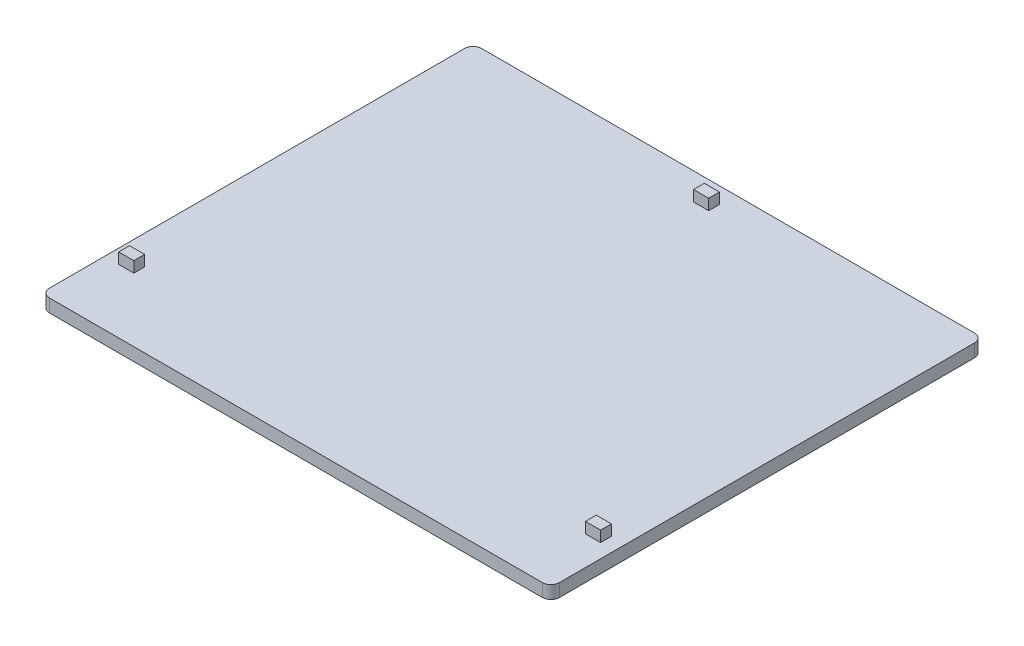
ISO-10303-21;
HEADER;
FILE_DESCRIPTION(('STEP AP214'),'2;1');
FILE_NAME('part.step','',(''),(''),'','','');
FILE_SCHEMA(('AUTOMOTIVE_DESIGN { 1 0 10303 214 1 1 1 1 }'));
ENDSEC;
DATA;
#1=APPLICATION_CONTEXT('core data for automotive mechanical design processes');
#2=APPLICATION_PROTOCOL_DEFINITION('international standard','automotive_design',2000,#1);
#3=PRODUCT_CONTEXT('',#1,'mechanical');
#4=PRODUCT('Part','Part','',(#3));
#5=PRODUCT_RELATED_PRODUCT_CATEGORY('part','',(#4));
#6=PRODUCT_DEFINITION_FORMATION('','',#4);
#7=PRODUCT_DEFINITION_CONTEXT('part definition',#1,'design');
#8=PRODUCT_DEFINITION('design','',#6,#7);
#9=PRODUCT_DEFINITION_SHAPE('','',#8);
#10=(LENGTH_UNIT() NAMED_UNIT(*) SI_UNIT(.MILLI.,.METRE.));
#11=(NAMED_UNIT(*) PLANE_ANGLE_UNIT() SI_UNIT($,.RADIAN.));
#12=(NAMED_UNIT(*) SI_UNIT($,.STERADIAN.) SOLID_ANGLE_UNIT());
#13=UNCERTAINTY_MEASURE_WITH_UNIT(LENGTH_MEASURE(1.E-05),#10,'distance_accuracy_value','');
#14=(GEOMETRIC_REPRESENTATION_CONTEXT(3) GLOBAL_UNCERTAINTY_ASSIGNED_CONTEXT((#13)) GLOBAL_UNIT_ASSIGNED_CONTEXT((#10,
#11,#12)) REPRESENTATION_CONTEXT('',''));
#15=CARTESIAN_POINT('',(0.,0.,0.));
#16=DIRECTION('',(0.,0.,1.));
#17=DIRECTION('',(1.,0.,0.));
#18=AXIS2_PLACEMENT_3D('',#15,#16,#17);
#19=CARTESIAN_POINT('',(0.,3.,0.));
#20=DIRECTION('',(0.,1.,0.));
#21=DIRECTION('',(0.,0.,1.));
#22=AXIS2_PLACEMENT_3D('',#19,#20,#21);
#23=PLANE('',#22);
#24=DIRECTION('',(-1.,0.,0.));
#25=VECTOR('',#24,1.);
#26=CARTESIAN_POINT('',(-59.,3.,-50.));
#27=LINE('',#26,#25);
#28=CARTESIAN_POINT('',(57.,3.,-50.));
#29=VERTEX_POINT('',#28);
#30=CARTESIAN_POINT('',(-57.,3.,-50.));
#31=VERTEX_POINT('',#30);
#32=EDGE_CURVE('E268',#29,#31,#27,.T.);
#33=ORIENTED_EDGE('',*,*,#32,.T.);
#34=CARTESIAN_POINT('',(-57.,3.,-48.));
#35=DIRECTION('',(0.,1.,0.));
#36=DIRECTION('',(0.,0.,1.));
#37=AXIS2_PLACEMENT_3D('',#34,#35,#36);
#38=CIRCLE('',#37,2.);
#39=CARTESIAN_POINT('',(-59.,3.,-48.));
#40=VERTEX_POINT('',#39);
#41=EDGE_CURVE('E309',#31,#40,#38,.T.);
#42=ORIENTED_EDGE('',*,*,#41,.T.);
#43=DIRECTION('',(0.,0.,1.));
#44=VECTOR('',#43,1.);
#45=CARTESIAN_POINT('',(-59.,3.,-50.));
#46=LINE('',#45,#44);
#47=CARTESIAN_POINT('',(-59.,3.,48.));
#48=VERTEX_POINT('',#47);
#49=EDGE_CURVE('E272',#40,#48,#46,.T.);
#50=ORIENTED_EDGE('',*,*,#49,.T.);
#51=CARTESIAN_POINT('',(-57.,3.,48.));
#52=DIRECTION('',(0.,1.,0.));
#53=DIRECTION('',(0.,0.,1.));
#54=AXIS2_PLACEMENT_3D('',#51,#52,#53);
#55=CIRCLE('',#54,2.);
#56=CARTESIAN_POINT('',(-57.,3.,50.));
#57=VERTEX_POINT('',#56);
#58=EDGE_CURVE('E303',#48,#57,#55,.T.);
#59=ORIENTED_EDGE('',*,*,#58,.T.);
#60=DIRECTION('',(1.,0.,0.));
#61=VECTOR('',#60,1.);
#62=CARTESIAN_POINT('',(-59.,3.,50.));
#63=LINE('',#62,#61);
#64=CARTESIAN_POINT('',(57.,3.,50.));
#65=VERTEX_POINT('',#64);
#66=EDGE_CURVE('E275',#57,#65,#63,.T.);
#67=ORIENTED_EDGE('',*,*,#66,.T.);
#68=CARTESIAN_POINT('',(57.,3.,48.));
#69=DIRECTION('',(0.,1.,0.));
#70=DIRECTION('',(0.,0.,1.));
#71=AXIS2_PLACEMENT_3D('',#68,#69,#70);
#72=CIRCLE('',#71,2.);
#73=CARTESIAN_POINT('',(59.,3.,48.));
#74=VERTEX_POINT('',#73);
#75=EDGE_CURVE('E305',#65,#74,#72,.T.);
#76=ORIENTED_EDGE('',*,*,#75,.T.);
#77=DIRECTION('',(0.,0.,-1.));
#78=VECTOR('',#77,1.);
#79=CARTESIAN_POINT('',(59.,3.,-50.));
#80=LINE('',#79,#78);
#81=CARTESIAN_POINT('',(59.,3.,-48.));
#82=VERTEX_POINT('',#81);
#83=EDGE_CURVE('E265',#74,#82,#80,.T.);
#84=ORIENTED_EDGE('',*,*,#83,.T.);
#85=CARTESIAN_POINT('',(57.,3.,-48.));
#86=DIRECTION('',(0.,1.,0.));
#87=DIRECTION('',(0.,0.,1.));
#88=AXIS2_PLACEMENT_3D('',#85,#86,#87);
#89=CIRCLE('',#88,2.);
#90=EDGE_CURVE('E307',#82,#29,#89,.T.);
#91=ORIENTED_EDGE('',*,*,#90,.T.);
#92=EDGE_LOOP('',(#33,#42,#50,#59,#67,#76,#84,#91));
#93=FACE_BOUND('',#92,.T.);
#94=DIRECTION('',(-1.,0.,0.));
#95=VECTOR('',#94,1.);
#96=CARTESIAN_POINT('',(-1.75000000000002,3.,-46.25));
#97=LINE('',#96,#95);
#98=CARTESIAN_POINT('',(1.74999999999999,3.,-46.25));
#99=VERTEX_POINT('',#98);
#100=CARTESIAN_POINT('',(-1.75000000000002,3.,-46.25));
#101=VERTEX_POINT('',#100);
#102=EDGE_CURVE('E254',#99,#101,#97,.T.);
#103=ORIENTED_EDGE('',*,*,#102,.F.);
#104=DIRECTION('',(0.,0.,-1.));
#105=VECTOR('',#104,1.);
#106=CARTESIAN_POINT('',(1.74999999999999,3.,-46.25));
#107=LINE('',#106,#105);
#108=CARTESIAN_POINT('',(1.74999999999999,3.,-43.75));
#109=VERTEX_POINT('',#108);
#110=EDGE_CURVE('E212',#109,#99,#107,.T.);
#111=ORIENTED_EDGE('',*,*,#110,.F.);
#112=DIRECTION('',(1.,0.,0.));
#113=VECTOR('',#112,1.);
#114=CARTESIAN_POINT('',(-1.75000000000002,3.,-43.75));
#115=LINE('',#114,#113);
#116=CARTESIAN_POINT('',(-1.75000000000002,3.,-43.75));
#117=VERTEX_POINT('',#116);
#118=EDGE_CURVE('E248',#117,#109,#115,.T.);
#119=ORIENTED_EDGE('',*,*,#118,.F.);
#120=DIRECTION('',(0.,0.,1.));
#121=VECTOR('',#120,1.);
#122=CARTESIAN_POINT('',(-1.75000000000002,3.,-46.25));
#123=LINE('',#122,#121);
#124=EDGE_CURVE('E250',#101,#117,#123,.T.);
#125=ORIENTED_EDGE('',*,*,#124,.F.);
#126=EDGE_LOOP('',(#103,#111,#119,#125));
#127=FACE_BOUND('',#126,.T.);
#128=DIRECTION('',(-1.,0.,0.));
#129=VECTOR('',#128,1.);
#130=CARTESIAN_POINT('',(55.75,3.,32.75));
#131=LINE('',#130,#129);
#132=CARTESIAN_POINT('',(55.75,3.,32.75));
#133=VERTEX_POINT('',#132);
#134=CARTESIAN_POINT('',(52.25,3.,32.75));
#135=VERTEX_POINT('',#134);
#136=EDGE_CURVE('E225',#133,#135,#131,.T.);
#137=ORIENTED_EDGE('',*,*,#136,.F.);
#138=DIRECTION('',(0.,0.,-1.));
#139=VECTOR('',#138,1.);
#140=CARTESIAN_POINT('',(55.75,3.,32.75));
#141=LINE('',#140,#139);
#142=CARTESIAN_POINT('',(55.75,3.,35.25));
#143=VERTEX_POINT('',#142);
#144=EDGE_CURVE('E227',#143,#133,#141,.T.);
#145=ORIENTED_EDGE('',*,*,#144,.F.);
#146=DIRECTION('',(1.,0.,0.));
#147=VECTOR('',#146,1.);
#148=CARTESIAN_POINT('',(55.75,3.,35.25));
#149=LINE('',#148,#147);
#150=CARTESIAN_POINT('',(52.25,3.,35.25));
#151=VERTEX_POINT('',#150);
#152=EDGE_CURVE('E220',#151,#143,#149,.T.);
#153=ORIENTED_EDGE('',*,*,#152,.F.);
#154=DIRECTION('',(0.,0.,1.));
#155=VECTOR('',#154,1.);
#156=CARTESIAN_POINT('',(52.25,3.,32.75));
#157=LINE('',#156,#155);
#158=EDGE_CURVE('E222',#135,#151,#157,.T.);
#159=ORIENTED_EDGE('',*,*,#158,.F.);
#160=EDGE_LOOP('',(#137,#145,#153,#159));
#161=FACE_BOUND('',#160,.T.);
#162=DIRECTION('',(-1.,0.,0.));
#163=VECTOR('',#162,1.);
#164=CARTESIAN_POINT('',(-55.75,3.,32.75));
#165=LINE('',#164,#163);
#166=CARTESIAN_POINT('',(-52.25,3.,32.75));
#167=VERTEX_POINT('',#166);
#168=CARTESIAN_POINT('',(-55.75,3.,32.75));
#169=VERTEX_POINT('',#168);
#170=EDGE_CURVE('E547',#167,#169,#165,.T.);
#171=ORIENTED_EDGE('',*,*,#170,.F.);
#172=DIRECTION('',(0.,0.,-1.));
#173=VECTOR('',#172,1.);
#174=CARTESIAN_POINT('',(-52.25,3.,32.75));
#175=LINE('',#174,#173);
#176=CARTESIAN_POINT('',(-52.25,3.,35.25));
#177=VERTEX_POINT('',#176);
#178=EDGE_CURVE('E199',#177,#167,#175,.T.);
#179=ORIENTED_EDGE('',*,*,#178,.F.);
#180=DIRECTION('',(1.,0.,0.));
#181=VECTOR('',#180,1.);
#182=CARTESIAN_POINT('',(-55.75,3.,35.25));
#183=LINE('',#182,#181);
#184=CARTESIAN_POINT('',(-55.75,3.,35.25));
#185=VERTEX_POINT('',#184);
#186=EDGE_CURVE('E195',#185,#177,#183,.T.);
#187=ORIENTED_EDGE('',*,*,#186,.F.);
#188=DIRECTION('',(0.,0.,1.));
#189=VECTOR('',#188,1.);
#190=CARTESIAN_POINT('',(-55.75,3.,32.75));
#191=LINE('',#190,#189);
#192=EDGE_CURVE('E544',#169,#185,#191,.T.);
#193=ORIENTED_EDGE('',*,*,#192,.F.);
#194=EDGE_LOOP('',(#171,#179,#187,#193));
#195=FACE_BOUND('',#194,.T.);
#196=ADVANCED_FACE('F39',(#93,#127,#161,#195),#23,.T.);
#197=CARTESIAN_POINT('',(59.,3.,-50.));
#198=DIRECTION('',(-1.,0.,0.));
#199=DIRECTION('',(0.,0.,1.));
#200=AXIS2_PLACEMENT_3D('',#197,#198,#199);
#201=PLANE('',#200);
#202=DIRECTION('',(0.,0.,-1.));
#203=VECTOR('',#202,1.);
#204=CARTESIAN_POINT('',(59.,0.,-50.));
#205=LINE('',#204,#203);
#206=CARTESIAN_POINT('',(59.,0.,48.));
#207=VERTEX_POINT('',#206);
#208=CARTESIAN_POINT('',(59.,0.,-48.));
#209=VERTEX_POINT('',#208);
#210=EDGE_CURVE('E201',#207,#209,#205,.T.);
#211=ORIENTED_EDGE('',*,*,#210,.T.);
#212=DIRECTION('',(0.,-1.,0.));
#213=VECTOR('',#212,1.);
#214=CARTESIAN_POINT('',(59.,3.,-48.));
#215=LINE('',#214,#213);
#216=EDGE_CURVE('E314',#209,#82,#215,.F.);
#217=ORIENTED_EDGE('',*,*,#216,.T.);
#218=ORIENTED_EDGE('',*,*,#83,.F.);
#219=DIRECTION('',(0.,-1.,0.));
#220=VECTOR('',#219,1.);
#221=CARTESIAN_POINT('',(59.,3.,48.));
#222=LINE('',#221,#220);
#223=EDGE_CURVE('E311',#74,#207,#222,.T.);
#224=ORIENTED_EDGE('',*,*,#223,.T.);
#225=EDGE_LOOP('',(#211,#217,#218,#224));
#226=FACE_BOUND('',#225,.T.);
#227=ADVANCED_FACE('F334',(#226),#201,.F.);
#228=CARTESIAN_POINT('',(-59.,3.,-50.));
#229=DIRECTION('',(0.,0.,1.));
#230=DIRECTION('',(1.,0.,0.));
#231=AXIS2_PLACEMENT_3D('',#228,#229,#230);
#232=PLANE('',#231);
#233=DIRECTION('',(-1.,0.,0.));
#234=VECTOR('',#233,1.);
#235=CARTESIAN_POINT('',(-59.,0.,-50.));
#236=LINE('',#235,#234);
#237=CARTESIAN_POINT('',(57.,0.,-50.));
#238=VERTEX_POINT('',#237);
#239=CARTESIAN_POINT('',(-57.,0.,-50.));
#240=VERTEX_POINT('',#239);
#241=EDGE_CURVE('E204',#238,#240,#236,.T.);
#242=ORIENTED_EDGE('',*,*,#241,.T.);
#243=DIRECTION('',(0.,-1.,0.));
#244=VECTOR('',#243,1.);
#245=CARTESIAN_POINT('',(-57.,3.,-50.));
#246=LINE('',#245,#244);
#247=EDGE_CURVE('E301',#240,#31,#246,.F.);
#248=ORIENTED_EDGE('',*,*,#247,.T.);
#249=ORIENTED_EDGE('',*,*,#32,.F.);
#250=DIRECTION('',(0.,-1.,0.));
#251=VECTOR('',#250,1.);
#252=CARTESIAN_POINT('',(57.,3.,-50.));
#253=LINE('',#252,#251);
#254=EDGE_CURVE('E298',#29,#238,#253,.T.);
#255=ORIENTED_EDGE('',*,*,#254,.T.);
#256=EDGE_LOOP('',(#242,#248,#249,#255));
#257=FACE_BOUND('',#256,.T.);
#258=ADVANCED_FACE('F345',(#257),#232,.F.);
#259=CARTESIAN_POINT('',(-59.,3.,-50.));
#260=DIRECTION('',(1.,0.,0.));
#261=DIRECTION('',(0.,0.,-1.));
#262=AXIS2_PLACEMENT_3D('',#259,#260,#261);
#263=PLANE('',#262);
#264=ORIENTED_EDGE('',*,*,#49,.F.);
#265=DIRECTION('',(0.,-1.,0.));
#266=VECTOR('',#265,1.);
#267=CARTESIAN_POINT('',(-59.,3.,-48.));
#268=LINE('',#267,#266);
#269=CARTESIAN_POINT('',(-59.,0.,-48.));
#270=VERTEX_POINT('',#269);
#271=EDGE_CURVE('E287',#40,#270,#268,.T.);
#272=ORIENTED_EDGE('',*,*,#271,.T.);
#273=DIRECTION('',(0.,0.,1.));
#274=VECTOR('',#273,1.);
#275=CARTESIAN_POINT('',(-59.,0.,-50.));
#276=LINE('',#275,#274);
#277=CARTESIAN_POINT('',(-59.,0.,48.));
#278=VERTEX_POINT('',#277);
#279=EDGE_CURVE('E281',#270,#278,#276,.T.);
#280=ORIENTED_EDGE('',*,*,#279,.T.);
#281=DIRECTION('',(0.,-1.,0.));
#282=VECTOR('',#281,1.);
#283=CARTESIAN_POINT('',(-59.,3.,48.));
#284=LINE('',#283,#282);
#285=EDGE_CURVE('E277',#278,#48,#284,.F.);
#286=ORIENTED_EDGE('',*,*,#285,.T.);
#287=EDGE_LOOP('',(#264,#272,#280,#286));
#288=FACE_BOUND('',#287,.T.);
#289=ADVANCED_FACE('F353',(#288),#263,.F.);
#290=CARTESIAN_POINT('',(-59.,3.,50.));
#291=DIRECTION('',(0.,0.,-1.));
#292=DIRECTION('',(-1.,0.,0.));
#293=AXIS2_PLACEMENT_3D('',#290,#291,#292);
#294=PLANE('',#293);
#295=DIRECTION('',(1.,0.,0.));
#296=VECTOR('',#295,1.);
#297=CARTESIAN_POINT('',(-59.,0.,50.));
#298=LINE('',#297,#296);
#299=CARTESIAN_POINT('',(-57.,0.,50.));
#300=VERTEX_POINT('',#299);
#301=CARTESIAN_POINT('',(57.,0.,50.));
#302=VERTEX_POINT('',#301);
#303=EDGE_CURVE('E269',#300,#302,#298,.T.);
#304=ORIENTED_EDGE('',*,*,#303,.T.);
#305=DIRECTION('',(0.,-1.,0.));
#306=VECTOR('',#305,1.);
#307=CARTESIAN_POINT('',(57.,3.,50.));
#308=LINE('',#307,#306);
#309=EDGE_CURVE('E11',#302,#65,#308,.F.);
#310=ORIENTED_EDGE('',*,*,#309,.T.);
#311=ORIENTED_EDGE('',*,*,#66,.F.);
#312=DIRECTION('',(0.,-1.,0.));
#313=VECTOR('',#312,1.);
#314=CARTESIAN_POINT('',(-57.,3.,50.));
#315=LINE('',#314,#313);
#316=EDGE_CURVE('E47',#57,#300,#315,.T.);
#317=ORIENTED_EDGE('',*,*,#316,.T.);
#318=EDGE_LOOP('',(#304,#310,#311,#317));
#319=FACE_BOUND('',#318,.T.);
#320=ADVANCED_FACE('F320',(#319),#294,.F.);
#321=CARTESIAN_POINT('',(0.,0.,0.));
#322=DIRECTION('',(0.,1.,0.));
#323=DIRECTION('',(0.,0.,1.));
#324=AXIS2_PLACEMENT_3D('',#321,#322,#323);
#325=PLANE('',#324);
#326=ORIENTED_EDGE('',*,*,#279,.F.);
#327=CARTESIAN_POINT('',(-57.,0.,-48.));
#328=DIRECTION('',(0.,1.,0.));
#329=DIRECTION('',(0.,0.,1.));
#330=AXIS2_PLACEMENT_3D('',#327,#328,#329);
#331=CIRCLE('',#330,2.);
#332=EDGE_CURVE('E296',#270,#240,#331,.F.);
#333=ORIENTED_EDGE('',*,*,#332,.T.);
#334=ORIENTED_EDGE('',*,*,#241,.F.);
#335=CARTESIAN_POINT('',(57.,0.,-48.));
#336=DIRECTION('',(0.,1.,0.));
#337=DIRECTION('',(0.,0.,1.));
#338=AXIS2_PLACEMENT_3D('',#335,#336,#337);
#339=CIRCLE('',#338,2.);
#340=EDGE_CURVE('E294',#238,#209,#339,.F.);
#341=ORIENTED_EDGE('',*,*,#340,.T.);
#342=ORIENTED_EDGE('',*,*,#210,.F.);
#343=CARTESIAN_POINT('',(57.,0.,48.));
#344=DIRECTION('',(0.,1.,0.));
#345=DIRECTION('',(0.,0.,1.));
#346=AXIS2_PLACEMENT_3D('',#343,#344,#345);
#347=CIRCLE('',#346,2.);
#348=EDGE_CURVE('E292',#207,#302,#347,.F.);
#349=ORIENTED_EDGE('',*,*,#348,.T.);
#350=ORIENTED_EDGE('',*,*,#303,.F.);
#351=CARTESIAN_POINT('',(-57.,0.,48.));
#352=DIRECTION('',(0.,1.,0.));
#353=DIRECTION('',(0.,0.,1.));
#354=AXIS2_PLACEMENT_3D('',#351,#352,#353);
#355=CIRCLE('',#354,2.);
#356=EDGE_CURVE('E290',#300,#278,#355,.F.);
#357=ORIENTED_EDGE('',*,*,#356,.T.);
#358=EDGE_LOOP('',(#326,#333,#334,#341,#342,#349,#350,#357));
#359=FACE_BOUND('',#358,.T.);
#360=ADVANCED_FACE('F326',(#359),#325,.F.);
#361=CARTESIAN_POINT('',(-57.,3.,-48.));
#362=DIRECTION('',(0.,-1.,0.));
#363=DIRECTION('',(0.,0.,-1.));
#364=AXIS2_PLACEMENT_3D('',#361,#362,#363);
#365=CYLINDRICAL_SURFACE('',#364,2.);
#366=ORIENTED_EDGE('',*,*,#41,.F.);
#367=ORIENTED_EDGE('',*,*,#247,.F.);
#368=ORIENTED_EDGE('',*,*,#332,.F.);
#369=ORIENTED_EDGE('',*,*,#271,.F.);
#370=EDGE_LOOP('',(#366,#367,#368,#369));
#371=FACE_BOUND('',#370,.T.);
#372=ADVANCED_FACE('F350',(#371),#365,.T.);
#373=CARTESIAN_POINT('',(57.,3.,-48.));
#374=DIRECTION('',(0.,-1.,0.));
#375=DIRECTION('',(0.,0.,-1.));
#376=AXIS2_PLACEMENT_3D('',#373,#374,#375);
#377=CYLINDRICAL_SURFACE('',#376,2.);
#378=ORIENTED_EDGE('',*,*,#90,.F.);
#379=ORIENTED_EDGE('',*,*,#216,.F.);
#380=ORIENTED_EDGE('',*,*,#340,.F.);
#381=ORIENTED_EDGE('',*,*,#254,.F.);
#382=EDGE_LOOP('',(#378,#379,#380,#381));
#383=FACE_BOUND('',#382,.T.);
#384=ADVANCED_FACE('F342',(#383),#377,.T.);
#385=CARTESIAN_POINT('',(57.,3.,48.));
#386=DIRECTION('',(0.,-1.,0.));
#387=DIRECTION('',(0.,0.,-1.));
#388=AXIS2_PLACEMENT_3D('',#385,#386,#387);
#389=CYLINDRICAL_SURFACE('',#388,2.);
#390=ORIENTED_EDGE('',*,*,#75,.F.);
#391=ORIENTED_EDGE('',*,*,#309,.F.);
#392=ORIENTED_EDGE('',*,*,#348,.F.);
#393=ORIENTED_EDGE('',*,*,#223,.F.);
#394=EDGE_LOOP('',(#390,#391,#392,#393));
#395=FACE_BOUND('',#394,.T.);
#396=ADVANCED_FACE('F331',(#395),#389,.T.);
#397=CARTESIAN_POINT('',(-57.,3.,48.));
#398=DIRECTION('',(0.,-1.,0.));
#399=DIRECTION('',(0.,0.,-1.));
#400=AXIS2_PLACEMENT_3D('',#397,#398,#399);
#401=CYLINDRICAL_SURFACE('',#400,2.);
#402=ORIENTED_EDGE('',*,*,#58,.F.);
#403=ORIENTED_EDGE('',*,*,#285,.F.);
#404=ORIENTED_EDGE('',*,*,#356,.F.);
#405=ORIENTED_EDGE('',*,*,#316,.F.);
#406=EDGE_LOOP('',(#402,#403,#404,#405));
#407=FACE_BOUND('',#406,.T.);
#408=ADVANCED_FACE('F41',(#407),#401,.T.);
#409=CARTESIAN_POINT('',(1.74999999999999,5.5,-46.25));
#410=DIRECTION('',(-1.,0.,0.));
#411=DIRECTION('',(0.,0.,1.));
#412=AXIS2_PLACEMENT_3D('',#409,#410,#411);
#413=PLANE('',#412);
#414=ORIENTED_EDGE('',*,*,#110,.T.);
#415=DIRECTION('',(0.,-1.,0.));
#416=VECTOR('',#415,1.);
#417=CARTESIAN_POINT('',(1.74999999999999,5.5,-46.25));
#418=LINE('',#417,#416);
#419=CARTESIAN_POINT('',(1.74999999999999,5.5,-46.25));
#420=VERTEX_POINT('',#419);
#421=EDGE_CURVE('E237',#420,#99,#418,.T.);
#422=ORIENTED_EDGE('',*,*,#421,.F.);
#423=DIRECTION('',(0.,0.,-1.));
#424=VECTOR('',#423,1.);
#425=CARTESIAN_POINT('',(1.74999999999999,5.5,-46.25));
#426=LINE('',#425,#424);
#427=CARTESIAN_POINT('',(1.74999999999999,5.5,-43.75));
#428=VERTEX_POINT('',#427);
#429=EDGE_CURVE('E251',#428,#420,#426,.T.);
#430=ORIENTED_EDGE('',*,*,#429,.F.);
#431=DIRECTION('',(0.,-1.,0.));
#432=VECTOR('',#431,1.);
#433=CARTESIAN_POINT('',(1.74999999999999,5.5,-43.75));
#434=LINE('',#433,#432);
#435=EDGE_CURVE('E244',#428,#109,#434,.T.);
#436=ORIENTED_EDGE('',*,*,#435,.T.);
#437=EDGE_LOOP('',(#414,#422,#430,#436));
#438=FACE_BOUND('',#437,.T.);
#439=ADVANCED_FACE('F356',(#438),#413,.F.);
#440=CARTESIAN_POINT('',(-1.75000000000002,5.5,-46.25));
#441=DIRECTION('',(0.,0.,1.));
#442=DIRECTION('',(1.,0.,0.));
#443=AXIS2_PLACEMENT_3D('',#440,#441,#442);
#444=PLANE('',#443);
#445=ORIENTED_EDGE('',*,*,#102,.T.);
#446=DIRECTION('',(0.,-1.,0.));
#447=VECTOR('',#446,1.);
#448=CARTESIAN_POINT('',(-1.75000000000002,5.5,-46.25));
#449=LINE('',#448,#447);
#450=CARTESIAN_POINT('',(-1.75000000000002,5.5,-46.25));
#451=VERTEX_POINT('',#450);
#452=EDGE_CURVE('E239',#451,#101,#449,.T.);
#453=ORIENTED_EDGE('',*,*,#452,.F.);
#454=DIRECTION('',(-1.,0.,0.));
#455=VECTOR('',#454,1.);
#456=CARTESIAN_POINT('',(-1.75000000000002,5.5,-46.25));
#457=LINE('',#456,#455);
#458=EDGE_CURVE('E261',#420,#451,#457,.T.);
#459=ORIENTED_EDGE('',*,*,#458,.F.);
#460=ORIENTED_EDGE('',*,*,#421,.T.);
#461=EDGE_LOOP('',(#445,#453,#459,#460));
#462=FACE_BOUND('',#461,.T.);
#463=ADVANCED_FACE('F362',(#462),#444,.F.);
#464=CARTESIAN_POINT('',(-1.75000000000002,5.5,-46.25));
#465=DIRECTION('',(1.,0.,0.));
#466=DIRECTION('',(0.,0.,-1.));
#467=AXIS2_PLACEMENT_3D('',#464,#465,#466);
#468=PLANE('',#467);
#469=ORIENTED_EDGE('',*,*,#124,.T.);
#470=DIRECTION('',(0.,-1.,0.));
#471=VECTOR('',#470,1.);
#472=CARTESIAN_POINT('',(-1.75000000000002,5.5,-43.75));
#473=LINE('',#472,#471);
#474=CARTESIAN_POINT('',(-1.75000000000002,5.5,-43.75));
#475=VERTEX_POINT('',#474);
#476=EDGE_CURVE('E242',#475,#117,#473,.T.);
#477=ORIENTED_EDGE('',*,*,#476,.F.);
#478=DIRECTION('',(0.,0.,1.));
#479=VECTOR('',#478,1.);
#480=CARTESIAN_POINT('',(-1.75000000000002,5.5,-46.25));
#481=LINE('',#480,#479);
#482=EDGE_CURVE('E259',#451,#475,#481,.T.);
#483=ORIENTED_EDGE('',*,*,#482,.F.);
#484=ORIENTED_EDGE('',*,*,#452,.T.);
#485=EDGE_LOOP('',(#469,#477,#483,#484));
#486=FACE_BOUND('',#485,.T.);
#487=ADVANCED_FACE('F418',(#486),#468,.F.);
#488=CARTESIAN_POINT('',(-1.75000000000002,5.5,-43.75));
#489=DIRECTION('',(0.,0.,-1.));
#490=DIRECTION('',(-1.,0.,0.));
#491=AXIS2_PLACEMENT_3D('',#488,#489,#490);
#492=PLANE('',#491);
#493=ORIENTED_EDGE('',*,*,#118,.T.);
#494=ORIENTED_EDGE('',*,*,#435,.F.);
#495=DIRECTION('',(1.,0.,0.));
#496=VECTOR('',#495,1.);
#497=CARTESIAN_POINT('',(-1.75000000000002,5.5,-43.75));
#498=LINE('',#497,#496);
#499=EDGE_CURVE('E247',#475,#428,#498,.T.);
#500=ORIENTED_EDGE('',*,*,#499,.F.);
#501=ORIENTED_EDGE('',*,*,#476,.T.);
#502=EDGE_LOOP('',(#493,#494,#500,#501));
#503=FACE_BOUND('',#502,.T.);
#504=ADVANCED_FACE('F428',(#503),#492,.F.);
#505=CARTESIAN_POINT('',(0.,5.5,0.));
#506=DIRECTION('',(0.,1.,0.));
#507=DIRECTION('',(0.,0.,1.));
#508=AXIS2_PLACEMENT_3D('',#505,#506,#507);
#509=PLANE('',#508);
#510=ORIENTED_EDGE('',*,*,#429,.T.);
#511=ORIENTED_EDGE('',*,*,#458,.T.);
#512=ORIENTED_EDGE('',*,*,#482,.T.);
#513=ORIENTED_EDGE('',*,*,#499,.T.);
#514=EDGE_LOOP('',(#510,#511,#512,#513));
#515=FACE_BOUND('',#514,.T.);
#516=ADVANCED_FACE('F372',(#515),#509,.T.);
#517=CARTESIAN_POINT('',(55.75,5.5,32.75));
#518=DIRECTION('',(-1.,0.,0.));
#519=DIRECTION('',(0.,0.,1.));
#520=AXIS2_PLACEMENT_3D('',#517,#518,#519);
#521=PLANE('',#520);
#522=ORIENTED_EDGE('',*,*,#144,.T.);
#523=DIRECTION('',(0.,-1.,0.));
#524=VECTOR('',#523,1.);
#525=CARTESIAN_POINT('',(55.75,5.5,32.75));
#526=LINE('',#525,#524);
#527=CARTESIAN_POINT('',(55.75,5.5,32.75));
#528=VERTEX_POINT('',#527);
#529=EDGE_CURVE('E209',#528,#133,#526,.T.);
#530=ORIENTED_EDGE('',*,*,#529,.F.);
#531=DIRECTION('',(0.,0.,-1.));
#532=VECTOR('',#531,1.);
#533=CARTESIAN_POINT('',(55.75,5.5,32.75));
#534=LINE('',#533,#532);
#535=CARTESIAN_POINT('',(55.75,5.5,35.25));
#536=VERTEX_POINT('',#535);
#537=EDGE_CURVE('E223',#536,#528,#534,.T.);
#538=ORIENTED_EDGE('',*,*,#537,.F.);
#539=DIRECTION('',(0.,-1.,0.));
#540=VECTOR('',#539,1.);
#541=CARTESIAN_POINT('',(55.75,5.5,35.25));
#542=LINE('',#541,#540);
#543=EDGE_CURVE('E216',#536,#143,#542,.T.);
#544=ORIENTED_EDGE('',*,*,#543,.T.);
#545=EDGE_LOOP('',(#522,#530,#538,#544));
#546=FACE_BOUND('',#545,.T.);
#547=ADVANCED_FACE('F446',(#546),#521,.F.);
#548=CARTESIAN_POINT('',(55.75,5.5,32.75));
#549=DIRECTION('',(0.,0.,1.));
#550=DIRECTION('',(1.,0.,0.));
#551=AXIS2_PLACEMENT_3D('',#548,#549,#550);
#552=PLANE('',#551);
#553=ORIENTED_EDGE('',*,*,#136,.T.);
#554=DIRECTION('',(0.,-1.,0.));
#555=VECTOR('',#554,1.);
#556=CARTESIAN_POINT('',(52.25,5.5,32.75));
#557=LINE('',#556,#555);
#558=CARTESIAN_POINT('',(52.25,5.5,32.75));
#559=VERTEX_POINT('',#558);
#560=EDGE_CURVE('E211',#559,#135,#557,.T.);
#561=ORIENTED_EDGE('',*,*,#560,.F.);
#562=DIRECTION('',(-1.,0.,0.));
#563=VECTOR('',#562,1.);
#564=CARTESIAN_POINT('',(55.75,5.5,32.75));
#565=LINE('',#564,#563);
#566=EDGE_CURVE('E233',#528,#559,#565,.T.);
#567=ORIENTED_EDGE('',*,*,#566,.F.);
#568=ORIENTED_EDGE('',*,*,#529,.T.);
#569=EDGE_LOOP('',(#553,#561,#567,#568));
#570=FACE_BOUND('',#569,.T.);
#571=ADVANCED_FACE('F455',(#570),#552,.F.);
#572=CARTESIAN_POINT('',(52.25,5.5,32.75));
#573=DIRECTION('',(1.,0.,0.));
#574=DIRECTION('',(0.,0.,-1.));
#575=AXIS2_PLACEMENT_3D('',#572,#573,#574);
#576=PLANE('',#575);
#577=ORIENTED_EDGE('',*,*,#158,.T.);
#578=DIRECTION('',(0.,-1.,0.));
#579=VECTOR('',#578,1.);
#580=CARTESIAN_POINT('',(52.25,5.5,35.25));
#581=LINE('',#580,#579);
#582=CARTESIAN_POINT('',(52.25,5.5,35.25));
#583=VERTEX_POINT('',#582);
#584=EDGE_CURVE('E62',#583,#151,#581,.T.);
#585=ORIENTED_EDGE('',*,*,#584,.F.);
#586=DIRECTION('',(0.,0.,1.));
#587=VECTOR('',#586,1.);
#588=CARTESIAN_POINT('',(52.25,5.5,32.75));
#589=LINE('',#588,#587);
#590=EDGE_CURVE('E231',#559,#583,#589,.T.);
#591=ORIENTED_EDGE('',*,*,#590,.F.);
#592=ORIENTED_EDGE('',*,*,#560,.T.);
#593=EDGE_LOOP('',(#577,#585,#591,#592));
#594=FACE_BOUND('',#593,.T.);
#595=ADVANCED_FACE('F465',(#594),#576,.F.);
#596=CARTESIAN_POINT('',(55.75,5.5,35.25));
#597=DIRECTION('',(0.,0.,-1.));
#598=DIRECTION('',(-1.,0.,0.));
#599=AXIS2_PLACEMENT_3D('',#596,#597,#598);
#600=PLANE('',#599);
#601=ORIENTED_EDGE('',*,*,#152,.T.);
#602=ORIENTED_EDGE('',*,*,#543,.F.);
#603=DIRECTION('',(1.,0.,0.));
#604=VECTOR('',#603,1.);
#605=CARTESIAN_POINT('',(55.75,5.5,35.25));
#606=LINE('',#605,#604);
#607=EDGE_CURVE('E219',#583,#536,#606,.T.);
#608=ORIENTED_EDGE('',*,*,#607,.F.);
#609=ORIENTED_EDGE('',*,*,#584,.T.);
#610=EDGE_LOOP('',(#601,#602,#608,#609));
#611=FACE_BOUND('',#610,.T.);
#612=ADVANCED_FACE('F475',(#611),#600,.F.);
#613=CARTESIAN_POINT('',(0.,5.5,0.));
#614=DIRECTION('',(0.,-1.,0.));
#615=DIRECTION('',(0.,0.,-1.));
#616=AXIS2_PLACEMENT_3D('',#613,#614,#615);
#617=PLANE('',#616);
#618=ORIENTED_EDGE('',*,*,#537,.T.);
#619=ORIENTED_EDGE('',*,*,#566,.T.);
#620=ORIENTED_EDGE('',*,*,#590,.T.);
#621=ORIENTED_EDGE('',*,*,#607,.T.);
#622=EDGE_LOOP('',(#618,#619,#620,#621));
#623=FACE_BOUND('',#622,.T.);
#624=ADVANCED_FACE('F485',(#623),#617,.F.);
#625=CARTESIAN_POINT('',(-52.25,5.5,32.75));
#626=DIRECTION('',(-1.,0.,0.));
#627=DIRECTION('',(0.,0.,1.));
#628=AXIS2_PLACEMENT_3D('',#625,#626,#627);
#629=PLANE('',#628);
#630=ORIENTED_EDGE('',*,*,#178,.T.);
#631=DIRECTION('',(0.,-1.,0.));
#632=VECTOR('',#631,1.);
#633=CARTESIAN_POINT('',(-52.25,5.5,32.75));
#634=LINE('',#633,#632);
#635=CARTESIAN_POINT('',(-52.25,5.5,32.75));
#636=VERTEX_POINT('',#635);
#637=EDGE_CURVE('E180',#636,#167,#634,.T.);
#638=ORIENTED_EDGE('',*,*,#637,.F.);
#639=DIRECTION('',(0.,0.,-1.));
#640=VECTOR('',#639,1.);
#641=CARTESIAN_POINT('',(-52.25,5.5,32.75));
#642=LINE('',#641,#640);
#643=CARTESIAN_POINT('',(-52.25,5.5,35.25));
#644=VERTEX_POINT('',#643);
#645=EDGE_CURVE('E187',#644,#636,#642,.T.);
#646=ORIENTED_EDGE('',*,*,#645,.F.);
#647=DIRECTION('',(0.,-1.,0.));
#648=VECTOR('',#647,1.);
#649=CARTESIAN_POINT('',(-52.25,5.5,35.25));
#650=LINE('',#649,#648);
#651=EDGE_CURVE('E541',#644,#177,#650,.T.);
#652=ORIENTED_EDGE('',*,*,#651,.T.);
#653=EDGE_LOOP('',(#630,#638,#646,#652));
#654=FACE_BOUND('',#653,.T.);
#655=ADVANCED_FACE('F197',(#654),#629,.F.);
#656=CARTESIAN_POINT('',(-55.75,5.5,32.75));
#657=DIRECTION('',(0.,0.,1.));
#658=DIRECTION('',(1.,0.,0.));
#659=AXIS2_PLACEMENT_3D('',#656,#657,#658);
#660=PLANE('',#659);
#661=ORIENTED_EDGE('',*,*,#170,.T.);
#662=DIRECTION('',(0.,-1.,0.));
#663=VECTOR('',#662,1.);
#664=CARTESIAN_POINT('',(-55.75,5.5,32.75));
#665=LINE('',#664,#663);
#666=CARTESIAN_POINT('',(-55.75,5.5,32.75));
#667=VERTEX_POINT('',#666);
#668=EDGE_CURVE('E183',#667,#169,#665,.T.);
#669=ORIENTED_EDGE('',*,*,#668,.F.);
#670=DIRECTION('',(-1.,0.,0.));
#671=VECTOR('',#670,1.);
#672=CARTESIAN_POINT('',(-55.75,5.5,32.75));
#673=LINE('',#672,#671);
#674=EDGE_CURVE('E176',#636,#667,#673,.T.);
#675=ORIENTED_EDGE('',*,*,#674,.F.);
#676=ORIENTED_EDGE('',*,*,#637,.T.);
#677=EDGE_LOOP('',(#661,#669,#675,#676));
#678=FACE_BOUND('',#677,.T.);
#679=ADVANCED_FACE('F178',(#678),#660,.F.);
#680=CARTESIAN_POINT('',(-55.75,5.5,32.75));
#681=DIRECTION('',(1.,0.,0.));
#682=DIRECTION('',(0.,0.,-1.));
#683=AXIS2_PLACEMENT_3D('',#680,#681,#682);
#684=PLANE('',#683);
#685=ORIENTED_EDGE('',*,*,#192,.T.);
#686=DIRECTION('',(0.,-1.,0.));
#687=VECTOR('',#686,1.);
#688=CARTESIAN_POINT('',(-55.75,5.5,35.25));
#689=LINE('',#688,#687);
#690=CARTESIAN_POINT('',(-55.75,5.5,35.25));
#691=VERTEX_POINT('',#690);
#692=EDGE_CURVE('E54',#691,#185,#689,.T.);
#693=ORIENTED_EDGE('',*,*,#692,.F.);
#694=DIRECTION('',(0.,0.,1.));
#695=VECTOR('',#694,1.);
#696=CARTESIAN_POINT('',(-55.75,5.5,32.75));
#697=LINE('',#696,#695);
#698=EDGE_CURVE('E186',#667,#691,#697,.T.);
#699=ORIENTED_EDGE('',*,*,#698,.F.);
#700=ORIENTED_EDGE('',*,*,#668,.T.);
#701=EDGE_LOOP('',(#685,#693,#699,#700));
#702=FACE_BOUND('',#701,.T.);
#703=ADVANCED_FACE('F511',(#702),#684,.F.);
#704=CARTESIAN_POINT('',(-55.75,5.5,35.25));
#705=DIRECTION('',(0.,0.,-1.));
#706=DIRECTION('',(-1.,0.,0.));
#707=AXIS2_PLACEMENT_3D('',#704,#705,#706);
#708=PLANE('',#707);
#709=ORIENTED_EDGE('',*,*,#186,.T.);
#710=ORIENTED_EDGE('',*,*,#651,.F.);
#711=DIRECTION('',(1.,0.,0.));
#712=VECTOR('',#711,1.);
#713=CARTESIAN_POINT('',(-55.75,5.5,35.25));
#714=LINE('',#713,#712);
#715=EDGE_CURVE('E191',#691,#644,#714,.T.);
#716=ORIENTED_EDGE('',*,*,#715,.F.);
#717=ORIENTED_EDGE('',*,*,#692,.T.);
#718=EDGE_LOOP('',(#709,#710,#716,#717));
#719=FACE_BOUND('',#718,.T.);
#720=ADVANCED_FACE('F520',(#719),#708,.F.);
#721=CARTESIAN_POINT('',(0.,5.5,0.));
#722=DIRECTION('',(0.,1.,0.));
#723=DIRECTION('',(0.,0.,1.));
#724=AXIS2_PLACEMENT_3D('',#721,#722,#723);
#725=PLANE('',#724);
#726=ORIENTED_EDGE('',*,*,#645,.T.);
#727=ORIENTED_EDGE('',*,*,#674,.T.);
#728=ORIENTED_EDGE('',*,*,#698,.T.);
#729=ORIENTED_EDGE('',*,*,#715,.T.);
#730=EDGE_LOOP('',(#726,#727,#728,#729));
#731=FACE_BOUND('',#730,.T.);
#732=ADVANCED_FACE('F190',(#731),#725,.T.);
#733=CLOSED_SHELL('',(#196,#227,#258,#289,#320,#360,#372,#384,#396,#408,#439,#463,#487,#504,
#516,#547,#571,#595,#612,#624,#655,#679,#703,#720,#732));
#734=MANIFOLD_SOLID_BREP('B2',#733);
#735=ADVANCED_BREP_SHAPE_REPRESENTATION('',(#18,#734),#14);
#736=SHAPE_DEFINITION_REPRESENTATION(#9,#735);
ENDSEC;
END-ISO-10303-21;
